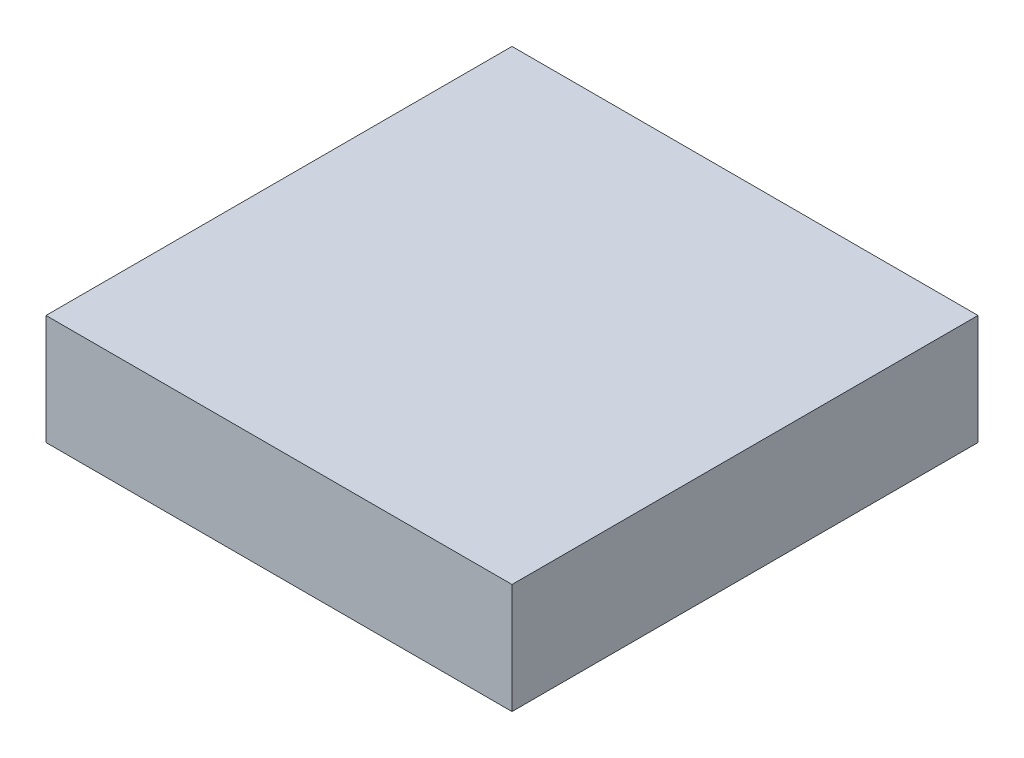
ISO-10303-21;
HEADER;
FILE_DESCRIPTION(('STEP AP214'),'2;1');
FILE_NAME('part.step','',(''),(''),'','','');
FILE_SCHEMA(('AUTOMOTIVE_DESIGN { 1 0 10303 214 1 1 1 1 }'));
ENDSEC;
DATA;
#1=APPLICATION_CONTEXT('core data for automotive mechanical design processes');
#2=APPLICATION_PROTOCOL_DEFINITION('international standard','automotive_design',2000,#1);
#3=PRODUCT_CONTEXT('',#1,'mechanical');
#4=PRODUCT('Part','Part','',(#3));
#5=PRODUCT_RELATED_PRODUCT_CATEGORY('part','',(#4));
#6=PRODUCT_DEFINITION_FORMATION('','',#4);
#7=PRODUCT_DEFINITION_CONTEXT('part definition',#1,'design');
#8=PRODUCT_DEFINITION('design','',#6,#7);
#9=PRODUCT_DEFINITION_SHAPE('','',#8);
#10=(LENGTH_UNIT() NAMED_UNIT(*) SI_UNIT(.MILLI.,.METRE.));
#11=(NAMED_UNIT(*) PLANE_ANGLE_UNIT() SI_UNIT($,.RADIAN.));
#12=(NAMED_UNIT(*) SI_UNIT($,.STERADIAN.) SOLID_ANGLE_UNIT());
#13=UNCERTAINTY_MEASURE_WITH_UNIT(LENGTH_MEASURE(1.E-05),#10,'distance_accuracy_value','');
#14=(GEOMETRIC_REPRESENTATION_CONTEXT(3) GLOBAL_UNCERTAINTY_ASSIGNED_CONTEXT((#13)) GLOBAL_UNIT_ASSIGNED_CONTEXT((#10,
#11,#12)) REPRESENTATION_CONTEXT('',''));
#15=CARTESIAN_POINT('',(0.,0.,0.));
#16=DIRECTION('',(0.,0.,1.));
#17=DIRECTION('',(1.,0.,0.));
#18=AXIS2_PLACEMENT_3D('',#15,#16,#17);
#19=CARTESIAN_POINT('',(0.,3.,0.));
#20=DIRECTION('',(1.,0.,0.));
#21=DIRECTION('',(0.,0.,-1.));
#22=AXIS2_PLACEMENT_3D('',#19,#20,#21);
#23=PLANE('',#22);
#24=DIRECTION('',(0.,0.,1.));
#25=VECTOR('',#24,1.);
#26=CARTESIAN_POINT('',(0.,0.,0.));
#27=LINE('',#26,#25);
#28=CARTESIAN_POINT('',(0.,0.,-12.7));
#29=VERTEX_POINT('',#28);
#30=CARTESIAN_POINT('',(0.,0.,0.));
#31=VERTEX_POINT('',#30);
#32=EDGE_CURVE('E96',#29,#31,#27,.T.);
#33=ORIENTED_EDGE('',*,*,#32,.T.);
#34=DIRECTION('',(0.,-1.,0.));
#35=VECTOR('',#34,1.);
#36=CARTESIAN_POINT('',(0.,3.,0.));
#37=LINE('',#36,#35);
#38=CARTESIAN_POINT('',(0.,3.,0.));
#39=VERTEX_POINT('',#38);
#40=EDGE_CURVE('E11',#39,#31,#37,.T.);
#41=ORIENTED_EDGE('',*,*,#40,.F.);
#42=DIRECTION('',(0.,0.,1.));
#43=VECTOR('',#42,1.);
#44=CARTESIAN_POINT('',(0.,3.,0.));
#45=LINE('',#44,#43);
#46=CARTESIAN_POINT('',(0.,3.,-12.7));
#47=VERTEX_POINT('',#46);
#48=EDGE_CURVE('E84',#47,#39,#45,.T.);
#49=ORIENTED_EDGE('',*,*,#48,.F.);
#50=DIRECTION('',(0.,-1.,0.));
#51=VECTOR('',#50,1.);
#52=CARTESIAN_POINT('',(0.,3.,-12.7));
#53=LINE('',#52,#51);
#54=EDGE_CURVE('E92',#47,#29,#53,.T.);
#55=ORIENTED_EDGE('',*,*,#54,.T.);
#56=EDGE_LOOP('',(#33,#41,#49,#55));
#57=FACE_BOUND('',#56,.T.);
#58=ADVANCED_FACE('F33',(#57),#23,.F.);
#59=CARTESIAN_POINT('',(0.,3.,0.));
#60=DIRECTION('',(0.,0.,-1.));
#61=DIRECTION('',(-1.,0.,0.));
#62=AXIS2_PLACEMENT_3D('',#59,#60,#61);
#63=PLANE('',#62);
#64=DIRECTION('',(1.,0.,0.));
#65=VECTOR('',#64,1.);
#66=CARTESIAN_POINT('',(0.,0.,0.));
#67=LINE('',#66,#65);
#68=CARTESIAN_POINT('',(12.7,0.,0.));
#69=VERTEX_POINT('',#68);
#70=EDGE_CURVE('E88',#31,#69,#67,.T.);
#71=ORIENTED_EDGE('',*,*,#70,.T.);
#72=DIRECTION('',(0.,-1.,0.));
#73=VECTOR('',#72,1.);
#74=CARTESIAN_POINT('',(12.7,3.,0.));
#75=LINE('',#74,#73);
#76=CARTESIAN_POINT('',(12.7,3.,0.));
#77=VERTEX_POINT('',#76);
#78=EDGE_CURVE('E41',#77,#69,#75,.T.);
#79=ORIENTED_EDGE('',*,*,#78,.F.);
#80=DIRECTION('',(1.,0.,0.));
#81=VECTOR('',#80,1.);
#82=CARTESIAN_POINT('',(0.,3.,0.));
#83=LINE('',#82,#81);
#84=EDGE_CURVE('E79',#39,#77,#83,.T.);
#85=ORIENTED_EDGE('',*,*,#84,.F.);
#86=ORIENTED_EDGE('',*,*,#40,.T.);
#87=EDGE_LOOP('',(#71,#79,#85,#86));
#88=FACE_BOUND('',#87,.T.);
#89=ADVANCED_FACE('F87',(#88),#63,.F.);
#90=CARTESIAN_POINT('',(12.7,3.,0.));
#91=DIRECTION('',(-1.,0.,0.));
#92=DIRECTION('',(0.,0.,1.));
#93=AXIS2_PLACEMENT_3D('',#90,#91,#92);
#94=PLANE('',#93);
#95=DIRECTION('',(0.,0.,-1.));
#96=VECTOR('',#95,1.);
#97=CARTESIAN_POINT('',(12.7,0.,0.));
#98=LINE('',#97,#96);
#99=CARTESIAN_POINT('',(12.7,0.,-12.7));
#100=VERTEX_POINT('',#99);
#101=EDGE_CURVE('E66',#69,#100,#98,.T.);
#102=ORIENTED_EDGE('',*,*,#101,.T.);
#103=DIRECTION('',(0.,-1.,0.));
#104=VECTOR('',#103,1.);
#105=CARTESIAN_POINT('',(12.7,3.,-12.7));
#106=LINE('',#105,#104);
#107=CARTESIAN_POINT('',(12.7,3.,-12.7));
#108=VERTEX_POINT('',#107);
#109=EDGE_CURVE('E89',#108,#100,#106,.T.);
#110=ORIENTED_EDGE('',*,*,#109,.F.);
#111=DIRECTION('',(0.,0.,-1.));
#112=VECTOR('',#111,1.);
#113=CARTESIAN_POINT('',(12.7,3.,0.));
#114=LINE('',#113,#112);
#115=EDGE_CURVE('E82',#77,#108,#114,.T.);
#116=ORIENTED_EDGE('',*,*,#115,.F.);
#117=ORIENTED_EDGE('',*,*,#78,.T.);
#118=EDGE_LOOP('',(#102,#110,#116,#117));
#119=FACE_BOUND('',#118,.T.);
#120=ADVANCED_FACE('F90',(#119),#94,.F.);
#121=CARTESIAN_POINT('',(0.,3.,-12.7));
#122=DIRECTION('',(0.,0.,1.));
#123=DIRECTION('',(1.,0.,0.));
#124=AXIS2_PLACEMENT_3D('',#121,#122,#123);
#125=PLANE('',#124);
#126=DIRECTION('',(-1.,0.,0.));
#127=VECTOR('',#126,1.);
#128=CARTESIAN_POINT('',(0.,0.,-12.7));
#129=LINE('',#128,#127);
#130=EDGE_CURVE('E72',#100,#29,#129,.T.);
#131=ORIENTED_EDGE('',*,*,#130,.T.);
#132=ORIENTED_EDGE('',*,*,#54,.F.);
#133=DIRECTION('',(-1.,0.,0.));
#134=VECTOR('',#133,1.);
#135=CARTESIAN_POINT('',(0.,3.,-12.7));
#136=LINE('',#135,#134);
#137=EDGE_CURVE('E49',#108,#47,#136,.T.);
#138=ORIENTED_EDGE('',*,*,#137,.F.);
#139=ORIENTED_EDGE('',*,*,#109,.T.);
#140=EDGE_LOOP('',(#131,#132,#138,#139));
#141=FACE_BOUND('',#140,.T.);
#142=ADVANCED_FACE('F103',(#141),#125,.F.);
#143=CARTESIAN_POINT('',(0.,3.,0.));
#144=DIRECTION('',(0.,-1.,0.));
#145=DIRECTION('',(0.,0.,-1.));
#146=AXIS2_PLACEMENT_3D('',#143,#144,#145);
#147=PLANE('',#146);
#148=ORIENTED_EDGE('',*,*,#48,.T.);
#149=ORIENTED_EDGE('',*,*,#84,.T.);
#150=ORIENTED_EDGE('',*,*,#115,.T.);
#151=ORIENTED_EDGE('',*,*,#137,.T.);
#152=EDGE_LOOP('',(#148,#149,#150,#151));
#153=FACE_BOUND('',#152,.T.);
#154=ADVANCED_FACE('F80',(#153),#147,.F.);
#155=CARTESIAN_POINT('',(0.,0.,0.));
#156=DIRECTION('',(0.,-1.,0.));
#157=DIRECTION('',(0.,0.,-1.));
#158=AXIS2_PLACEMENT_3D('',#155,#156,#157);
#159=PLANE('',#158);
#160=ORIENTED_EDGE('',*,*,#32,.F.);
#161=ORIENTED_EDGE('',*,*,#130,.F.);
#162=ORIENTED_EDGE('',*,*,#101,.F.);
#163=ORIENTED_EDGE('',*,*,#70,.F.);
#164=EDGE_LOOP('',(#160,#161,#162,#163));
#165=FACE_BOUND('',#164,.T.);
#166=ADVANCED_FACE('F106',(#165),#159,.T.);
#167=CLOSED_SHELL('',(#58,#89,#120,#142,#154,#166));
#168=MANIFOLD_SOLID_BREP('B2',#167);
#169=ADVANCED_BREP_SHAPE_REPRESENTATION('',(#18,#168),#14);
#170=SHAPE_DEFINITION_REPRESENTATION(#9,#169);
ENDSEC;
END-ISO-10303-21;
